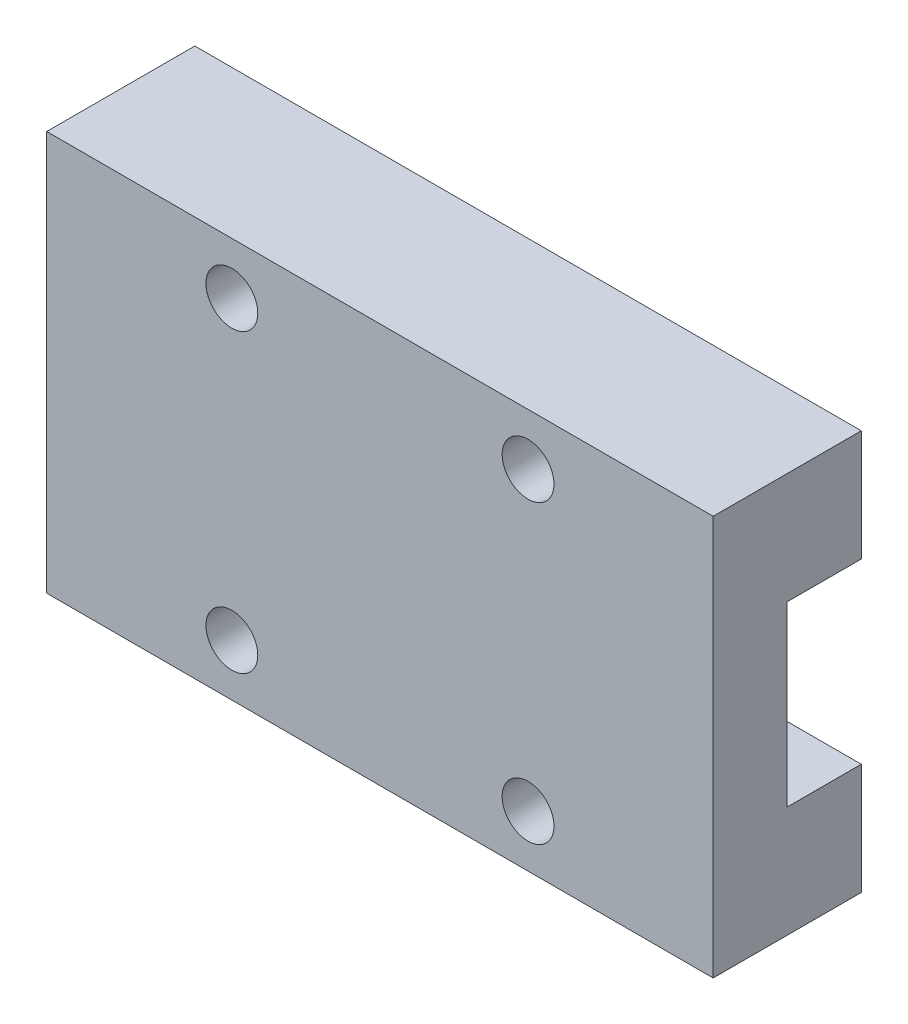
ISO-10303-21;
HEADER;
FILE_DESCRIPTION(('STEP AP214'),'2;1');
FILE_NAME('part.step','',(''),(''),'','','');
FILE_SCHEMA(('AUTOMOTIVE_DESIGN { 1 0 10303 214 1 1 1 1 }'));
ENDSEC;
DATA;
#1=APPLICATION_CONTEXT('core data for automotive mechanical design processes');
#2=APPLICATION_PROTOCOL_DEFINITION('international standard','automotive_design',2000,#1);
#3=PRODUCT_CONTEXT('',#1,'mechanical');
#4=PRODUCT('Part','Part','',(#3));
#5=PRODUCT_RELATED_PRODUCT_CATEGORY('part','',(#4));
#6=PRODUCT_DEFINITION_FORMATION('','',#4);
#7=PRODUCT_DEFINITION_CONTEXT('part definition',#1,'design');
#8=PRODUCT_DEFINITION('design','',#6,#7);
#9=PRODUCT_DEFINITION_SHAPE('','',#8);
#10=(LENGTH_UNIT() NAMED_UNIT(*) SI_UNIT(.MILLI.,.METRE.));
#11=(NAMED_UNIT(*) PLANE_ANGLE_UNIT() SI_UNIT($,.RADIAN.));
#12=(NAMED_UNIT(*) SI_UNIT($,.STERADIAN.) SOLID_ANGLE_UNIT());
#13=UNCERTAINTY_MEASURE_WITH_UNIT(LENGTH_MEASURE(1.E-05),#10,'distance_accuracy_value','');
#14=(GEOMETRIC_REPRESENTATION_CONTEXT(3) GLOBAL_UNCERTAINTY_ASSIGNED_CONTEXT((#13)) GLOBAL_UNIT_ASSIGNED_CONTEXT((#10,
#11,#12)) REPRESENTATION_CONTEXT('',''));
#15=CARTESIAN_POINT('',(0.,0.,0.));
#16=DIRECTION('',(0.,0.,1.));
#17=DIRECTION('',(1.,0.,0.));
#18=AXIS2_PLACEMENT_3D('',#15,#16,#17);
#19=CARTESIAN_POINT('',(22.5,13.5,5.));
#20=DIRECTION('',(0.,0.,-1.));
#21=DIRECTION('',(0.,1.,0.));
#22=AXIS2_PLACEMENT_3D('',#19,#20,#21);
#23=PLANE('',#22);
#24=CARTESIAN_POINT('',(10.,10.,5.));
#25=DIRECTION('',(0.,0.,-1.));
#26=DIRECTION('',(-1.,0.,0.));
#27=AXIS2_PLACEMENT_3D('',#24,#25,#26);
#28=CIRCLE('',#27,1.75);
#29=CARTESIAN_POINT('',(8.25,10.,5.));
#30=VERTEX_POINT('',#29);
#31=EDGE_CURVE('E231',#30,#30,#28,.T.);
#32=ORIENTED_EDGE('',*,*,#31,.T.);
#33=EDGE_LOOP('',(#32));
#34=FACE_BOUND('',#33,.T.);
#35=CARTESIAN_POINT('',(10.,-10.,5.));
#36=DIRECTION('',(0.,0.,1.));
#37=DIRECTION('',(-1.,0.,0.));
#38=AXIS2_PLACEMENT_3D('',#35,#36,#37);
#39=CIRCLE('',#38,1.75);
#40=CARTESIAN_POINT('',(8.25,-10.,5.));
#41=VERTEX_POINT('',#40);
#42=EDGE_CURVE('E223',#41,#41,#39,.T.);
#43=ORIENTED_EDGE('',*,*,#42,.F.);
#44=EDGE_LOOP('',(#43));
#45=FACE_BOUND('',#44,.T.);
#46=CARTESIAN_POINT('',(-10.,-10.,5.));
#47=DIRECTION('',(0.,0.,-1.));
#48=DIRECTION('',(1.,0.,0.));
#49=AXIS2_PLACEMENT_3D('',#46,#47,#48);
#50=CIRCLE('',#49,1.75);
#51=CARTESIAN_POINT('',(-8.25,-10.,5.));
#52=VERTEX_POINT('',#51);
#53=EDGE_CURVE('E215',#52,#52,#50,.T.);
#54=ORIENTED_EDGE('',*,*,#53,.T.);
#55=EDGE_LOOP('',(#54));
#56=FACE_BOUND('',#55,.T.);
#57=CARTESIAN_POINT('',(-10.,10.,5.));
#58=DIRECTION('',(0.,0.,1.));
#59=DIRECTION('',(1.,0.,0.));
#60=AXIS2_PLACEMENT_3D('',#57,#58,#59);
#61=CIRCLE('',#60,1.75);
#62=CARTESIAN_POINT('',(-8.25,10.,5.));
#63=VERTEX_POINT('',#62);
#64=EDGE_CURVE('E207',#63,#63,#61,.T.);
#65=ORIENTED_EDGE('',*,*,#64,.F.);
#66=EDGE_LOOP('',(#65));
#67=FACE_BOUND('',#66,.T.);
#68=DIRECTION('',(0.,-1.,0.));
#69=VECTOR('',#68,1.);
#70=CARTESIAN_POINT('',(-22.5,13.5,5.));
#71=LINE('',#70,#69);
#72=CARTESIAN_POINT('',(-22.5,13.5,5.));
#73=VERTEX_POINT('',#72);
#74=CARTESIAN_POINT('',(-22.5,-13.5,5.));
#75=VERTEX_POINT('',#74);
#76=EDGE_CURVE('E140',#73,#75,#71,.T.);
#77=ORIENTED_EDGE('',*,*,#76,.T.);
#78=DIRECTION('',(-1.,0.,0.));
#79=VECTOR('',#78,1.);
#80=CARTESIAN_POINT('',(22.5,-13.5,5.));
#81=LINE('',#80,#79);
#82=CARTESIAN_POINT('',(22.5,-13.5,5.));
#83=VERTEX_POINT('',#82);
#84=EDGE_CURVE('E11',#83,#75,#81,.T.);
#85=ORIENTED_EDGE('',*,*,#84,.F.);
#86=DIRECTION('',(0.,-1.,0.));
#87=VECTOR('',#86,1.);
#88=CARTESIAN_POINT('',(22.5,13.5,5.));
#89=LINE('',#88,#87);
#90=CARTESIAN_POINT('',(22.5,13.5,5.));
#91=VERTEX_POINT('',#90);
#92=EDGE_CURVE('E163',#91,#83,#89,.T.);
#93=ORIENTED_EDGE('',*,*,#92,.F.);
#94=DIRECTION('',(-1.,0.,0.));
#95=VECTOR('',#94,1.);
#96=CARTESIAN_POINT('',(22.5,13.5,5.));
#97=LINE('',#96,#95);
#98=EDGE_CURVE('E136',#91,#73,#97,.T.);
#99=ORIENTED_EDGE('',*,*,#98,.T.);
#100=EDGE_LOOP('',(#77,#85,#93,#99));
#101=FACE_BOUND('',#100,.T.);
#102=ADVANCED_FACE('F39',(#34,#45,#56,#67,#101),#23,.F.);
#103=CARTESIAN_POINT('',(22.5,-13.5,5.));
#104=DIRECTION('',(0.,1.,0.));
#105=DIRECTION('',(0.,0.,1.));
#106=AXIS2_PLACEMENT_3D('',#103,#104,#105);
#107=PLANE('',#106);
#108=DIRECTION('',(0.,0.,-1.));
#109=VECTOR('',#108,1.);
#110=CARTESIAN_POINT('',(-22.5,-13.5,5.));
#111=LINE('',#110,#109);
#112=CARTESIAN_POINT('',(-22.5,-13.5,-5.));
#113=VERTEX_POINT('',#112);
#114=EDGE_CURVE('E144',#75,#113,#111,.T.);
#115=ORIENTED_EDGE('',*,*,#114,.T.);
#116=DIRECTION('',(-1.,0.,0.));
#117=VECTOR('',#116,1.);
#118=CARTESIAN_POINT('',(22.5,-13.5,-5.));
#119=LINE('',#118,#117);
#120=CARTESIAN_POINT('',(22.5,-13.5,-5.));
#121=VERTEX_POINT('',#120);
#122=EDGE_CURVE('E48',#121,#113,#119,.T.);
#123=ORIENTED_EDGE('',*,*,#122,.F.);
#124=DIRECTION('',(0.,0.,-1.));
#125=VECTOR('',#124,1.);
#126=CARTESIAN_POINT('',(22.5,-13.5,5.));
#127=LINE('',#126,#125);
#128=EDGE_CURVE('E99',#83,#121,#127,.T.);
#129=ORIENTED_EDGE('',*,*,#128,.F.);
#130=ORIENTED_EDGE('',*,*,#84,.T.);
#131=EDGE_LOOP('',(#115,#123,#129,#130));
#132=FACE_BOUND('',#131,.T.);
#133=ADVANCED_FACE('F251',(#132),#107,.F.);
#134=CARTESIAN_POINT('',(22.5,-6.,-5.));
#135=DIRECTION('',(0.,0.,1.));
#136=DIRECTION('',(0.,-1.,0.));
#137=AXIS2_PLACEMENT_3D('',#134,#135,#136);
#138=PLANE('',#137);
#139=DIRECTION('',(0.,1.,0.));
#140=VECTOR('',#139,1.);
#141=CARTESIAN_POINT('',(-22.5,-6.,-5.));
#142=LINE('',#141,#140);
#143=CARTESIAN_POINT('',(-22.5,-6.,-5.));
#144=VERTEX_POINT('',#143);
#145=EDGE_CURVE('E148',#113,#144,#142,.T.);
#146=ORIENTED_EDGE('',*,*,#145,.T.);
#147=DIRECTION('',(-1.,0.,0.));
#148=VECTOR('',#147,1.);
#149=CARTESIAN_POINT('',(22.5,-6.,-5.));
#150=LINE('',#149,#148);
#151=CARTESIAN_POINT('',(22.5,-6.,-5.));
#152=VERTEX_POINT('',#151);
#153=EDGE_CURVE('E174',#152,#144,#150,.T.);
#154=ORIENTED_EDGE('',*,*,#153,.F.);
#155=DIRECTION('',(0.,1.,0.));
#156=VECTOR('',#155,1.);
#157=CARTESIAN_POINT('',(22.5,-6.,-5.));
#158=LINE('',#157,#156);
#159=EDGE_CURVE('E184',#121,#152,#158,.T.);
#160=ORIENTED_EDGE('',*,*,#159,.F.);
#161=ORIENTED_EDGE('',*,*,#122,.T.);
#162=EDGE_LOOP('',(#146,#154,#160,#161));
#163=FACE_BOUND('',#162,.T.);
#164=ADVANCED_FACE('F182',(#163),#138,.F.);
#165=CARTESIAN_POINT('',(22.5,-6.,0.));
#166=DIRECTION('',(0.,-1.,0.));
#167=DIRECTION('',(0.,0.,-1.));
#168=AXIS2_PLACEMENT_3D('',#165,#166,#167);
#169=PLANE('',#168);
#170=DIRECTION('',(0.,0.,1.));
#171=VECTOR('',#170,1.);
#172=CARTESIAN_POINT('',(-22.5,-6.,0.));
#173=LINE('',#172,#171);
#174=CARTESIAN_POINT('',(-22.5,-6.,0.));
#175=VERTEX_POINT('',#174);
#176=EDGE_CURVE('E151',#144,#175,#173,.T.);
#177=ORIENTED_EDGE('',*,*,#176,.T.);
#178=DIRECTION('',(-1.,0.,0.));
#179=VECTOR('',#178,1.);
#180=CARTESIAN_POINT('',(22.5,-6.,0.));
#181=LINE('',#180,#179);
#182=CARTESIAN_POINT('',(22.5,-6.,0.));
#183=VERTEX_POINT('',#182);
#184=EDGE_CURVE('E170',#183,#175,#181,.T.);
#185=ORIENTED_EDGE('',*,*,#184,.F.);
#186=DIRECTION('',(0.,0.,1.));
#187=VECTOR('',#186,1.);
#188=CARTESIAN_POINT('',(22.5,-6.,0.));
#189=LINE('',#188,#187);
#190=EDGE_CURVE('E197',#152,#183,#189,.T.);
#191=ORIENTED_EDGE('',*,*,#190,.F.);
#192=ORIENTED_EDGE('',*,*,#153,.T.);
#193=EDGE_LOOP('',(#177,#185,#191,#192));
#194=FACE_BOUND('',#193,.T.);
#195=ADVANCED_FACE('F192',(#194),#169,.F.);
#196=CARTESIAN_POINT('',(22.5,6.,0.));
#197=DIRECTION('',(0.,0.,1.));
#198=DIRECTION('',(0.,-1.,0.));
#199=AXIS2_PLACEMENT_3D('',#196,#197,#198);
#200=PLANE('',#199);
#201=DIRECTION('',(0.,1.,0.));
#202=VECTOR('',#201,1.);
#203=CARTESIAN_POINT('',(-22.5,6.,0.));
#204=LINE('',#203,#202);
#205=CARTESIAN_POINT('',(-22.5,6.,0.));
#206=VERTEX_POINT('',#205);
#207=EDGE_CURVE('E154',#175,#206,#204,.T.);
#208=ORIENTED_EDGE('',*,*,#207,.T.);
#209=DIRECTION('',(-1.,0.,0.));
#210=VECTOR('',#209,1.);
#211=CARTESIAN_POINT('',(22.5,6.,0.));
#212=LINE('',#211,#210);
#213=CARTESIAN_POINT('',(22.5,6.,0.));
#214=VERTEX_POINT('',#213);
#215=EDGE_CURVE('E129',#214,#206,#212,.T.);
#216=ORIENTED_EDGE('',*,*,#215,.F.);
#217=DIRECTION('',(0.,1.,0.));
#218=VECTOR('',#217,1.);
#219=CARTESIAN_POINT('',(22.5,6.,0.));
#220=LINE('',#219,#218);
#221=EDGE_CURVE('E118',#183,#214,#220,.T.);
#222=ORIENTED_EDGE('',*,*,#221,.F.);
#223=ORIENTED_EDGE('',*,*,#184,.T.);
#224=EDGE_LOOP('',(#208,#216,#222,#223));
#225=FACE_BOUND('',#224,.T.);
#226=ADVANCED_FACE('F195',(#225),#200,.F.);
#227=CARTESIAN_POINT('',(22.5,6.,0.));
#228=DIRECTION('',(0.,1.,0.));
#229=DIRECTION('',(0.,0.,1.));
#230=AXIS2_PLACEMENT_3D('',#227,#228,#229);
#231=PLANE('',#230);
#232=DIRECTION('',(0.,0.,-1.));
#233=VECTOR('',#232,1.);
#234=CARTESIAN_POINT('',(-22.5,6.,0.));
#235=LINE('',#234,#233);
#236=CARTESIAN_POINT('',(-22.5,6.,-5.));
#237=VERTEX_POINT('',#236);
#238=EDGE_CURVE('E127',#206,#237,#235,.T.);
#239=ORIENTED_EDGE('',*,*,#238,.T.);
#240=DIRECTION('',(-1.,0.,0.));
#241=VECTOR('',#240,1.);
#242=CARTESIAN_POINT('',(22.5,6.,-5.));
#243=LINE('',#242,#241);
#244=CARTESIAN_POINT('',(22.5,6.,-5.));
#245=VERTEX_POINT('',#244);
#246=EDGE_CURVE('E124',#245,#237,#243,.T.);
#247=ORIENTED_EDGE('',*,*,#246,.F.);
#248=DIRECTION('',(0.,0.,-1.));
#249=VECTOR('',#248,1.);
#250=CARTESIAN_POINT('',(22.5,6.,0.));
#251=LINE('',#250,#249);
#252=EDGE_CURVE('E112',#214,#245,#251,.T.);
#253=ORIENTED_EDGE('',*,*,#252,.F.);
#254=ORIENTED_EDGE('',*,*,#215,.T.);
#255=EDGE_LOOP('',(#239,#247,#253,#254));
#256=FACE_BOUND('',#255,.T.);
#257=ADVANCED_FACE('F125',(#256),#231,.F.);
#258=CARTESIAN_POINT('',(22.5,13.5,-5.));
#259=DIRECTION('',(0.,0.,1.));
#260=DIRECTION('',(0.,-1.,0.));
#261=AXIS2_PLACEMENT_3D('',#258,#259,#260);
#262=PLANE('',#261);
#263=DIRECTION('',(0.,1.,0.));
#264=VECTOR('',#263,1.);
#265=CARTESIAN_POINT('',(-22.5,13.5,-5.));
#266=LINE('',#265,#264);
#267=CARTESIAN_POINT('',(-22.5,13.5,-5.));
#268=VERTEX_POINT('',#267);
#269=EDGE_CURVE('E85',#237,#268,#266,.T.);
#270=ORIENTED_EDGE('',*,*,#269,.T.);
#271=DIRECTION('',(-1.,0.,0.));
#272=VECTOR('',#271,1.);
#273=CARTESIAN_POINT('',(22.5,13.5,-5.));
#274=LINE('',#273,#272);
#275=CARTESIAN_POINT('',(22.5,13.5,-5.));
#276=VERTEX_POINT('',#275);
#277=EDGE_CURVE('E130',#276,#268,#274,.T.);
#278=ORIENTED_EDGE('',*,*,#277,.F.);
#279=DIRECTION('',(0.,1.,0.));
#280=VECTOR('',#279,1.);
#281=CARTESIAN_POINT('',(22.5,13.5,-5.));
#282=LINE('',#281,#280);
#283=EDGE_CURVE('E116',#245,#276,#282,.T.);
#284=ORIENTED_EDGE('',*,*,#283,.F.);
#285=ORIENTED_EDGE('',*,*,#246,.T.);
#286=EDGE_LOOP('',(#270,#278,#284,#285));
#287=FACE_BOUND('',#286,.T.);
#288=ADVANCED_FACE('F132',(#287),#262,.F.);
#289=CARTESIAN_POINT('',(22.5,13.5,5.));
#290=DIRECTION('',(0.,-1.,0.));
#291=DIRECTION('',(0.,0.,-1.));
#292=AXIS2_PLACEMENT_3D('',#289,#290,#291);
#293=PLANE('',#292);
#294=DIRECTION('',(0.,0.,1.));
#295=VECTOR('',#294,1.);
#296=CARTESIAN_POINT('',(-22.5,13.5,5.));
#297=LINE('',#296,#295);
#298=EDGE_CURVE('E91',#268,#73,#297,.T.);
#299=ORIENTED_EDGE('',*,*,#298,.T.);
#300=ORIENTED_EDGE('',*,*,#98,.F.);
#301=DIRECTION('',(0.,0.,1.));
#302=VECTOR('',#301,1.);
#303=CARTESIAN_POINT('',(22.5,13.5,5.));
#304=LINE('',#303,#302);
#305=EDGE_CURVE('E56',#276,#91,#304,.T.);
#306=ORIENTED_EDGE('',*,*,#305,.F.);
#307=ORIENTED_EDGE('',*,*,#277,.T.);
#308=EDGE_LOOP('',(#299,#300,#306,#307));
#309=FACE_BOUND('',#308,.T.);
#310=ADVANCED_FACE('F266',(#309),#293,.F.);
#311=CARTESIAN_POINT('',(22.5,0.,0.));
#312=DIRECTION('',(1.,0.,0.));
#313=DIRECTION('',(0.,0.,-1.));
#314=AXIS2_PLACEMENT_3D('',#311,#312,#313);
#315=PLANE('',#314);
#316=ORIENTED_EDGE('',*,*,#92,.T.);
#317=ORIENTED_EDGE('',*,*,#128,.T.);
#318=ORIENTED_EDGE('',*,*,#159,.T.);
#319=ORIENTED_EDGE('',*,*,#190,.T.);
#320=ORIENTED_EDGE('',*,*,#221,.T.);
#321=ORIENTED_EDGE('',*,*,#252,.T.);
#322=ORIENTED_EDGE('',*,*,#283,.T.);
#323=ORIENTED_EDGE('',*,*,#305,.T.);
#324=EDGE_LOOP('',(#316,#317,#318,#319,#320,#321,#322,#323));
#325=FACE_BOUND('',#324,.T.);
#326=ADVANCED_FACE('F114',(#325),#315,.T.);
#327=CARTESIAN_POINT('',(-22.5,0.,0.));
#328=DIRECTION('',(1.,0.,0.));
#329=DIRECTION('',(0.,0.,-1.));
#330=AXIS2_PLACEMENT_3D('',#327,#328,#329);
#331=PLANE('',#330);
#332=ORIENTED_EDGE('',*,*,#76,.F.);
#333=ORIENTED_EDGE('',*,*,#298,.F.);
#334=ORIENTED_EDGE('',*,*,#269,.F.);
#335=ORIENTED_EDGE('',*,*,#238,.F.);
#336=ORIENTED_EDGE('',*,*,#207,.F.);
#337=ORIENTED_EDGE('',*,*,#176,.F.);
#338=ORIENTED_EDGE('',*,*,#145,.F.);
#339=ORIENTED_EDGE('',*,*,#114,.F.);
#340=EDGE_LOOP('',(#332,#333,#334,#335,#336,#337,#338,#339));
#341=FACE_BOUND('',#340,.T.);
#342=ADVANCED_FACE('F188',(#341),#331,.F.);
#343=CARTESIAN_POINT('',(-10.,10.,-3.));
#344=DIRECTION('',(0.,0.,1.));
#345=DIRECTION('',(1.,0.,0.));
#346=AXIS2_PLACEMENT_3D('',#343,#344,#345);
#347=CYLINDRICAL_SURFACE('',#346,1.75);
#348=CARTESIAN_POINT('',(-10.,10.,-3.));
#349=DIRECTION('',(0.,0.,1.));
#350=DIRECTION('',(1.,0.,0.));
#351=AXIS2_PLACEMENT_3D('',#348,#349,#350);
#352=CIRCLE('',#351,1.75);
#353=CARTESIAN_POINT('',(-8.25,10.,-3.));
#354=VERTEX_POINT('',#353);
#355=EDGE_CURVE('E145',#354,#354,#352,.T.);
#356=ORIENTED_EDGE('',*,*,#355,.F.);
#357=EDGE_LOOP('',(#356));
#358=FACE_BOUND('',#357,.T.);
#359=ORIENTED_EDGE('',*,*,#64,.T.);
#360=EDGE_LOOP('',(#359));
#361=FACE_BOUND('',#360,.T.);
#362=ADVANCED_FACE('F323',(#358,#361),#347,.F.);
#363=CARTESIAN_POINT('',(-10.,10.,-3.));
#364=DIRECTION('',(0.,0.,1.));
#365=DIRECTION('',(1.,0.,0.));
#366=AXIS2_PLACEMENT_3D('',#363,#364,#365);
#367=PLANE('',#366);
#368=ORIENTED_EDGE('',*,*,#355,.T.);
#369=EDGE_LOOP('',(#368));
#370=FACE_BOUND('',#369,.T.);
#371=ADVANCED_FACE('F331',(#370),#367,.T.);
#372=CARTESIAN_POINT('',(-10.,-10.,-3.));
#373=DIRECTION('',(0.,0.,1.));
#374=DIRECTION('',(1.,0.,0.));
#375=AXIS2_PLACEMENT_3D('',#372,#373,#374);
#376=CYLINDRICAL_SURFACE('',#375,1.75);
#377=CARTESIAN_POINT('',(-10.,-10.,-3.));
#378=DIRECTION('',(0.,0.,-1.));
#379=DIRECTION('',(1.,0.,0.));
#380=AXIS2_PLACEMENT_3D('',#377,#378,#379);
#381=CIRCLE('',#380,1.75);
#382=CARTESIAN_POINT('',(-8.25,-10.,-3.));
#383=VERTEX_POINT('',#382);
#384=EDGE_CURVE('E211',#383,#383,#381,.T.);
#385=ORIENTED_EDGE('',*,*,#384,.T.);
#386=EDGE_LOOP('',(#385));
#387=FACE_BOUND('',#386,.T.);
#388=ORIENTED_EDGE('',*,*,#53,.F.);
#389=EDGE_LOOP('',(#388));
#390=FACE_BOUND('',#389,.T.);
#391=ADVANCED_FACE('F341',(#387,#390),#376,.F.);
#392=CARTESIAN_POINT('',(-10.,-10.,-3.));
#393=DIRECTION('',(0.,0.,1.));
#394=DIRECTION('',(1.,0.,0.));
#395=AXIS2_PLACEMENT_3D('',#392,#393,#394);
#396=PLANE('',#395);
#397=ORIENTED_EDGE('',*,*,#384,.F.);
#398=EDGE_LOOP('',(#397));
#399=FACE_BOUND('',#398,.T.);
#400=ADVANCED_FACE('F351',(#399),#396,.T.);
#401=CARTESIAN_POINT('',(10.,-10.,-3.));
#402=DIRECTION('',(0.,0.,1.));
#403=DIRECTION('',(1.,0.,0.));
#404=AXIS2_PLACEMENT_3D('',#401,#402,#403);
#405=CYLINDRICAL_SURFACE('',#404,1.75);
#406=CARTESIAN_POINT('',(10.,-10.,-3.));
#407=DIRECTION('',(0.,0.,1.));
#408=DIRECTION('',(-1.,0.,0.));
#409=AXIS2_PLACEMENT_3D('',#406,#407,#408);
#410=CIRCLE('',#409,1.75);
#411=CARTESIAN_POINT('',(8.25,-10.,-3.));
#412=VERTEX_POINT('',#411);
#413=EDGE_CURVE('E219',#412,#412,#410,.T.);
#414=ORIENTED_EDGE('',*,*,#413,.F.);
#415=EDGE_LOOP('',(#414));
#416=FACE_BOUND('',#415,.T.);
#417=ORIENTED_EDGE('',*,*,#42,.T.);
#418=EDGE_LOOP('',(#417));
#419=FACE_BOUND('',#418,.T.);
#420=ADVANCED_FACE('F360',(#416,#419),#405,.F.);
#421=CARTESIAN_POINT('',(10.,-10.,-3.));
#422=DIRECTION('',(0.,0.,1.));
#423=DIRECTION('',(-1.,0.,0.));
#424=AXIS2_PLACEMENT_3D('',#421,#422,#423);
#425=PLANE('',#424);
#426=ORIENTED_EDGE('',*,*,#413,.T.);
#427=EDGE_LOOP('',(#426));
#428=FACE_BOUND('',#427,.T.);
#429=ADVANCED_FACE('F248',(#428),#425,.T.);
#430=CARTESIAN_POINT('',(10.,10.,-3.));
#431=DIRECTION('',(0.,0.,1.));
#432=DIRECTION('',(1.,0.,0.));
#433=AXIS2_PLACEMENT_3D('',#430,#431,#432);
#434=CYLINDRICAL_SURFACE('',#433,1.75);
#435=CARTESIAN_POINT('',(10.,10.,-3.));
#436=DIRECTION('',(0.,0.,-1.));
#437=DIRECTION('',(-1.,0.,0.));
#438=AXIS2_PLACEMENT_3D('',#435,#436,#437);
#439=CIRCLE('',#438,1.75);
#440=CARTESIAN_POINT('',(8.25,10.,-3.));
#441=VERTEX_POINT('',#440);
#442=EDGE_CURVE('E227',#441,#441,#439,.T.);
#443=ORIENTED_EDGE('',*,*,#442,.T.);
#444=EDGE_LOOP('',(#443));
#445=FACE_BOUND('',#444,.T.);
#446=ORIENTED_EDGE('',*,*,#31,.F.);
#447=EDGE_LOOP('',(#446));
#448=FACE_BOUND('',#447,.T.);
#449=ADVANCED_FACE('F239',(#445,#448),#434,.F.);
#450=CARTESIAN_POINT('',(10.,10.,-3.));
#451=DIRECTION('',(0.,0.,1.));
#452=DIRECTION('',(-1.,0.,0.));
#453=AXIS2_PLACEMENT_3D('',#450,#451,#452);
#454=PLANE('',#453);
#455=ORIENTED_EDGE('',*,*,#442,.F.);
#456=EDGE_LOOP('',(#455));
#457=FACE_BOUND('',#456,.T.);
#458=ADVANCED_FACE('F242',(#457),#454,.T.);
#459=CLOSED_SHELL('',(#102,#133,#164,#195,#226,#257,#288,#310,#326,#342,#362,#371,#391,#400,
#420,#429,#449,#458));
#460=MANIFOLD_SOLID_BREP('B2',#459);
#461=ADVANCED_BREP_SHAPE_REPRESENTATION('',(#18,#460),#14);
#462=SHAPE_DEFINITION_REPRESENTATION(#9,#461);
ENDSEC;
END-ISO-10303-21;
